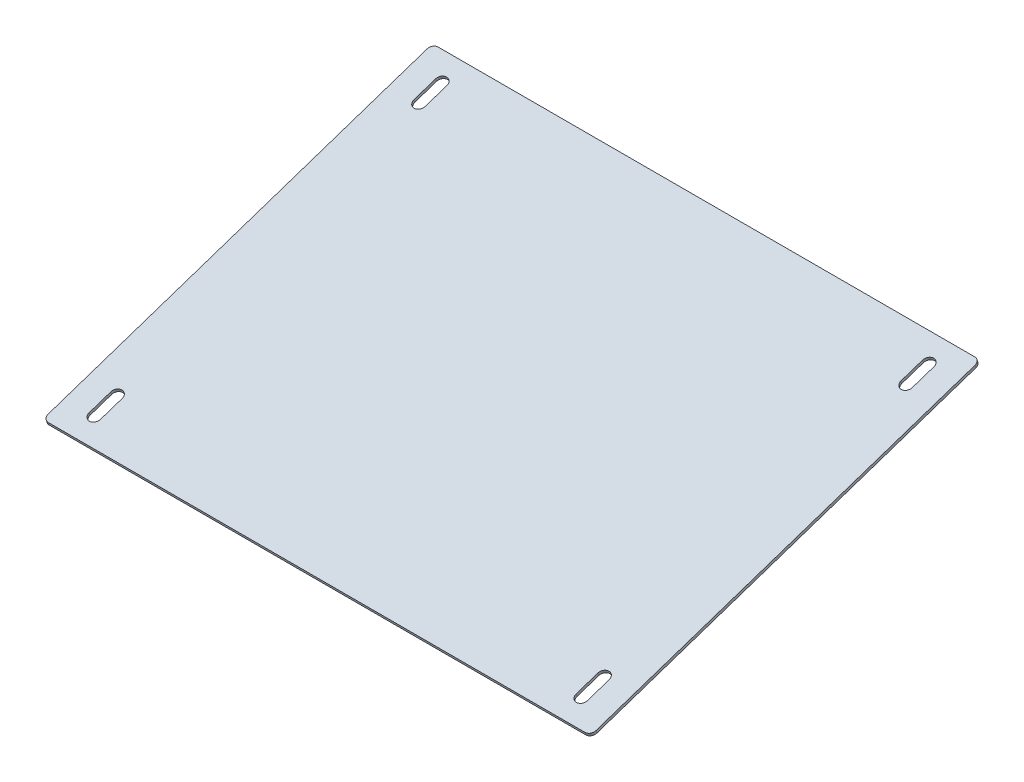
ISO-10303-21;
HEADER;
FILE_DESCRIPTION(('STEP AP214'),'2;1');
FILE_NAME('part.step','',(''),(''),'','','');
FILE_SCHEMA(('AUTOMOTIVE_DESIGN { 1 0 10303 214 1 1 1 1 }'));
ENDSEC;
DATA;
#1=APPLICATION_CONTEXT('core data for automotive mechanical design processes');
#2=APPLICATION_PROTOCOL_DEFINITION('international standard','automotive_design',2000,#1);
#3=PRODUCT_CONTEXT('',#1,'mechanical');
#4=PRODUCT('Part','Part','',(#3));
#5=PRODUCT_RELATED_PRODUCT_CATEGORY('part','',(#4));
#6=PRODUCT_DEFINITION_FORMATION('','',#4);
#7=PRODUCT_DEFINITION_CONTEXT('part definition',#1,'design');
#8=PRODUCT_DEFINITION('design','',#6,#7);
#9=PRODUCT_DEFINITION_SHAPE('','',#8);
#10=(LENGTH_UNIT() NAMED_UNIT(*) SI_UNIT(.MILLI.,.METRE.));
#11=(NAMED_UNIT(*) PLANE_ANGLE_UNIT() SI_UNIT($,.RADIAN.));
#12=(NAMED_UNIT(*) SI_UNIT($,.STERADIAN.) SOLID_ANGLE_UNIT());
#13=UNCERTAINTY_MEASURE_WITH_UNIT(LENGTH_MEASURE(1.E-05),#10,'distance_accuracy_value','');
#14=(GEOMETRIC_REPRESENTATION_CONTEXT(3) GLOBAL_UNCERTAINTY_ASSIGNED_CONTEXT((#13)) GLOBAL_UNIT_ASSIGNED_CONTEXT((#10,
#11,#12)) REPRESENTATION_CONTEXT('',''));
#15=CARTESIAN_POINT('',(0.,0.,0.));
#16=DIRECTION('',(0.,0.,1.));
#17=DIRECTION('',(1.,0.,0.));
#18=AXIS2_PLACEMENT_3D('',#15,#16,#17);
#19=CARTESIAN_POINT('',(277.283333333333,3.01092760528004,1.00744228408499));
#20=DIRECTION('',(-1.,0.,0.));
#21=DIRECTION('',(0.,0.,1.));
#22=AXIS2_PLACEMENT_3D('',#19,#20,#21);
#23=PLANE('',#22);
#24=DIRECTION('',(0.,0.317304656405087,-0.948323655206201));
#25=VECTOR('',#24,1.);
#26=CARTESIAN_POINT('',(277.283333333333,3.50951452999278E-13,-1.1606110765011E-12));
#27=LINE('',#26,#25);
#28=CARTESIAN_POINT('',(277.283333333334,-64.4763061815135,192.6993667379));
#29=VERTEX_POINT('',#28);
#30=CARTESIAN_POINT('',(277.283333333334,-56.4167679088242,168.611945895662));
#31=VERTEX_POINT('',#30);
#32=EDGE_CURVE('E314',#29,#31,#27,.T.);
#33=ORIENTED_EDGE('',*,*,#32,.F.);
#34=DIRECTION('',(0.,-0.948323655206201,-0.317304656405086));
#35=VECTOR('',#34,1.);
#36=CARTESIAN_POINT('',(277.283333333334,-61.4653785762338,193.706809021986));
#37=LINE('',#36,#35);
#38=CARTESIAN_POINT('',(277.283333333334,-61.4653785762338,193.706809021986));
#39=VERTEX_POINT('',#38);
#40=EDGE_CURVE('E322',#39,#29,#37,.T.);
#41=ORIENTED_EDGE('',*,*,#40,.F.);
#42=DIRECTION('',(0.,0.317304656405087,-0.948323655206201));
#43=VECTOR('',#42,1.);
#44=CARTESIAN_POINT('',(277.283333333333,3.01092760528004,1.00744228408499));
#45=LINE('',#44,#43);
#46=CARTESIAN_POINT('',(277.283333333334,-53.4058403035445,169.619388179748));
#47=VERTEX_POINT('',#46);
#48=EDGE_CURVE('E263',#39,#47,#45,.T.);
#49=ORIENTED_EDGE('',*,*,#48,.T.);
#50=DIRECTION('',(0.,-0.948323655206201,-0.317304656405086));
#51=VECTOR('',#50,1.);
#52=CARTESIAN_POINT('',(277.283333333334,-53.4058403035445,169.619388179748));
#53=LINE('',#52,#51);
#54=EDGE_CURVE('E329',#47,#31,#53,.T.);
#55=ORIENTED_EDGE('',*,*,#54,.T.);
#56=EDGE_LOOP('',(#33,#41,#49,#55));
#57=FACE_BOUND('',#56,.T.);
#58=ADVANCED_FACE('F35',(#57),#23,.T.);
#59=CARTESIAN_POINT('',(270.933333333333,-61.4653785762338,193.706809021986));
#60=DIRECTION('',(0.,-0.948323655206201,-0.317304656405086));
#61=DIRECTION('',(0.,0.317304656405086,-0.948323655206201));
#62=AXIS2_PLACEMENT_3D('',#59,#60,#61);
#63=CYLINDRICAL_SURFACE('',#62,6.35000000000002);
#64=CARTESIAN_POINT('',(270.933333333333,-64.4763061815135,192.6993667379));
#65=DIRECTION('',(0.,-0.948323655206201,-0.317304656405087));
#66=DIRECTION('',(0.,0.317304656405087,-0.948323655206201));
#67=AXIS2_PLACEMENT_3D('',#64,#65,#66);
#68=CIRCLE('',#67,6.35000000000002);
#69=CARTESIAN_POINT('',(264.583333333334,-64.4763061815134,192.6993667379));
#70=VERTEX_POINT('',#69);
#71=EDGE_CURVE('E223',#70,#29,#68,.F.);
#72=ORIENTED_EDGE('',*,*,#71,.F.);
#73=DIRECTION('',(0.,-0.948323655206201,-0.317304656405086));
#74=VECTOR('',#73,1.);
#75=CARTESIAN_POINT('',(264.583333333334,-61.4653785762337,193.706809021986));
#76=LINE('',#75,#74);
#77=CARTESIAN_POINT('',(264.583333333334,-61.4653785762337,193.706809021986));
#78=VERTEX_POINT('',#77);
#79=EDGE_CURVE('E325',#78,#70,#76,.T.);
#80=ORIENTED_EDGE('',*,*,#79,.F.);
#81=CARTESIAN_POINT('',(270.933333333333,-61.4653785762338,193.706809021986));
#82=DIRECTION('',(0.,-0.948323655206201,-0.317304656405087));
#83=DIRECTION('',(0.,0.317304656405087,-0.948323655206201));
#84=AXIS2_PLACEMENT_3D('',#81,#82,#83);
#85=CIRCLE('',#84,6.35000000000002);
#86=EDGE_CURVE('E218',#78,#39,#85,.F.);
#87=ORIENTED_EDGE('',*,*,#86,.T.);
#88=ORIENTED_EDGE('',*,*,#40,.T.);
#89=EDGE_LOOP('',(#72,#80,#87,#88));
#90=FACE_BOUND('',#89,.T.);
#91=ADVANCED_FACE('F421',(#90),#63,.F.);
#92=CARTESIAN_POINT('',(264.583333333335,3.01092760527929,1.00744228408724));
#93=DIRECTION('',(-1.,0.,0.));
#94=DIRECTION('',(0.,0.,1.));
#95=AXIS2_PLACEMENT_3D('',#92,#93,#94);
#96=PLANE('',#95);
#97=DIRECTION('',(0.,0.317304656405087,-0.948323655206201));
#98=VECTOR('',#97,1.);
#99=CARTESIAN_POINT('',(264.583333333335,-4.00242662323733E-13,1.08558238658166E-12));
#100=LINE('',#99,#98);
#101=CARTESIAN_POINT('',(264.583333333334,-56.4167679088242,168.611945895662));
#102=VERTEX_POINT('',#101);
#103=EDGE_CURVE('E226',#70,#102,#100,.T.);
#104=ORIENTED_EDGE('',*,*,#103,.T.);
#105=DIRECTION('',(0.,-0.948323655206201,-0.317304656405086));
#106=VECTOR('',#105,1.);
#107=CARTESIAN_POINT('',(264.583333333334,-53.4058403035445,169.619388179748));
#108=LINE('',#107,#106);
#109=CARTESIAN_POINT('',(264.583333333334,-53.4058403035445,169.619388179748));
#110=VERTEX_POINT('',#109);
#111=EDGE_CURVE('E327',#110,#102,#108,.T.);
#112=ORIENTED_EDGE('',*,*,#111,.F.);
#113=DIRECTION('',(0.,0.317304656405087,-0.948323655206201));
#114=VECTOR('',#113,1.);
#115=CARTESIAN_POINT('',(264.583333333335,3.01092760527929,1.00744228408724));
#116=LINE('',#115,#114);
#117=EDGE_CURVE('E269',#78,#110,#116,.T.);
#118=ORIENTED_EDGE('',*,*,#117,.F.);
#119=ORIENTED_EDGE('',*,*,#79,.T.);
#120=EDGE_LOOP('',(#104,#112,#118,#119));
#121=FACE_BOUND('',#120,.T.);
#122=ADVANCED_FACE('F427',(#121),#96,.F.);
#123=CARTESIAN_POINT('',(264.583333333336,3.01092760528076,1.00744228408285));
#124=DIRECTION('',(1.,0.,0.));
#125=DIRECTION('',(0.,0.,-1.));
#126=AXIS2_PLACEMENT_3D('',#123,#124,#125);
#127=PLANE('',#126);
#128=DIRECTION('',(0.,-0.317304656405087,0.948323655206201));
#129=VECTOR('',#128,1.);
#130=CARTESIAN_POINT('',(264.583333333336,1.0675862350167E-12,-3.30129576677926E-12));
#131=LINE('',#130,#129);
#132=CARTESIAN_POINT('',(264.583333333333,64.4763061815136,-192.6993667379));
#133=VERTEX_POINT('',#132);
#134=CARTESIAN_POINT('',(264.583333333334,56.4167679088244,-168.611945895663));
#135=VERTEX_POINT('',#134);
#136=EDGE_CURVE('E302',#133,#135,#131,.T.);
#137=ORIENTED_EDGE('',*,*,#136,.F.);
#138=DIRECTION('',(0.,-0.948323655206201,-0.317304656405086));
#139=VECTOR('',#138,1.);
#140=CARTESIAN_POINT('',(264.583333333333,67.4872337867933,-191.691924453814));
#141=LINE('',#140,#139);
#142=CARTESIAN_POINT('',(264.583333333333,67.4872337867933,-191.691924453814));
#143=VERTEX_POINT('',#142);
#144=EDGE_CURVE('E331',#143,#133,#141,.T.);
#145=ORIENTED_EDGE('',*,*,#144,.F.);
#146=DIRECTION('',(0.,-0.317304656405087,0.948323655206201));
#147=VECTOR('',#146,1.);
#148=CARTESIAN_POINT('',(264.583333333336,3.01092760528076,1.00744228408285));
#149=LINE('',#148,#147);
#150=CARTESIAN_POINT('',(264.583333333334,59.4276955141041,-167.604503611576));
#151=VERTEX_POINT('',#150);
#152=EDGE_CURVE('E252',#143,#151,#149,.T.);
#153=ORIENTED_EDGE('',*,*,#152,.T.);
#154=DIRECTION('',(0.,-0.948323655206201,-0.317304656405086));
#155=VECTOR('',#154,1.);
#156=CARTESIAN_POINT('',(264.583333333334,59.4276955141041,-167.604503611576));
#157=LINE('',#156,#155);
#158=EDGE_CURVE('E337',#151,#135,#157,.T.);
#159=ORIENTED_EDGE('',*,*,#158,.T.);
#160=EDGE_LOOP('',(#137,#145,#153,#159));
#161=FACE_BOUND('',#160,.T.);
#162=ADVANCED_FACE('F439',(#161),#127,.T.);
#163=CARTESIAN_POINT('',(270.933333333333,67.4872337867932,-191.691924453814));
#164=DIRECTION('',(0.,-0.948323655206201,-0.317304656405086));
#165=DIRECTION('',(0.,0.317304656405086,-0.948323655206201));
#166=AXIS2_PLACEMENT_3D('',#163,#164,#165);
#167=CYLINDRICAL_SURFACE('',#166,6.35000000000002);
#168=CARTESIAN_POINT('',(270.933333333333,64.4763061815135,-192.6993667379));
#169=DIRECTION('',(0.,-0.948323655206201,-0.317304656405087));
#170=DIRECTION('',(0.,0.317304656405087,-0.948323655206201));
#171=AXIS2_PLACEMENT_3D('',#168,#169,#170);
#172=CIRCLE('',#171,6.35000000000002);
#173=CARTESIAN_POINT('',(277.283333333333,64.4763061815136,-192.6993667379));
#174=VERTEX_POINT('',#173);
#175=EDGE_CURVE('E311',#174,#133,#172,.F.);
#176=ORIENTED_EDGE('',*,*,#175,.F.);
#177=DIRECTION('',(0.,-0.948323655206201,-0.317304656405086));
#178=VECTOR('',#177,1.);
#179=CARTESIAN_POINT('',(277.283333333333,67.4872337867933,-191.691924453814));
#180=LINE('',#179,#178);
#181=CARTESIAN_POINT('',(277.283333333333,67.4872337867933,-191.691924453814));
#182=VERTEX_POINT('',#181);
#183=EDGE_CURVE('E333',#182,#174,#180,.T.);
#184=ORIENTED_EDGE('',*,*,#183,.F.);
#185=CARTESIAN_POINT('',(270.933333333333,67.4872337867932,-191.691924453814));
#186=DIRECTION('',(0.,-0.948323655206201,-0.317304656405087));
#187=DIRECTION('',(0.,0.317304656405087,-0.948323655206201));
#188=AXIS2_PLACEMENT_3D('',#185,#186,#187);
#189=CIRCLE('',#188,6.35000000000002);
#190=EDGE_CURVE('E260',#182,#143,#189,.F.);
#191=ORIENTED_EDGE('',*,*,#190,.T.);
#192=ORIENTED_EDGE('',*,*,#144,.T.);
#193=EDGE_LOOP('',(#176,#184,#191,#192));
#194=FACE_BOUND('',#193,.T.);
#195=ADVANCED_FACE('F435',(#194),#167,.F.);
#196=CARTESIAN_POINT('',(277.283333333335,3.01092760528042,1.00744228408384));
#197=DIRECTION('',(1.,0.,0.));
#198=DIRECTION('',(0.,0.,-1.));
#199=AXIS2_PLACEMENT_3D('',#196,#197,#198);
#200=PLANE('',#199);
#201=DIRECTION('',(0.,-0.317304656405087,0.948323655206201));
#202=VECTOR('',#201,1.);
#203=CARTESIAN_POINT('',(277.283333333335,7.35522624102473E-13,-2.30997315268166E-12));
#204=LINE('',#203,#202);
#205=CARTESIAN_POINT('',(277.283333333334,56.4167679088244,-168.611945895663));
#206=VERTEX_POINT('',#205);
#207=EDGE_CURVE('E308',#174,#206,#204,.T.);
#208=ORIENTED_EDGE('',*,*,#207,.T.);
#209=DIRECTION('',(0.,-0.948323655206201,-0.317304656405086));
#210=VECTOR('',#209,1.);
#211=CARTESIAN_POINT('',(277.283333333334,59.4276955141041,-167.604503611576));
#212=LINE('',#211,#210);
#213=CARTESIAN_POINT('',(277.283333333334,59.4276955141041,-167.604503611576));
#214=VERTEX_POINT('',#213);
#215=EDGE_CURVE('E335',#214,#206,#212,.T.);
#216=ORIENTED_EDGE('',*,*,#215,.F.);
#217=DIRECTION('',(0.,-0.317304656405087,0.948323655206201));
#218=VECTOR('',#217,1.);
#219=CARTESIAN_POINT('',(277.283333333335,3.01092760528042,1.00744228408384));
#220=LINE('',#219,#218);
#221=EDGE_CURVE('E258',#182,#214,#220,.T.);
#222=ORIENTED_EDGE('',*,*,#221,.F.);
#223=ORIENTED_EDGE('',*,*,#183,.T.);
#224=EDGE_LOOP('',(#208,#216,#222,#223));
#225=FACE_BOUND('',#224,.T.);
#226=ADVANCED_FACE('F438',(#225),#200,.F.);
#227=CARTESIAN_POINT('',(0.,75.5467720594824,-215.779345296051));
#228=DIRECTION('',(0.,-0.317304656405086,0.948323655206201));
#229=DIRECTION('',(0.,-0.948323655206201,-0.317304656405086));
#230=AXIS2_PLACEMENT_3D('',#227,#228,#229);
#231=PLANE('',#230);
#232=DIRECTION('',(-1.,0.,0.));
#233=VECTOR('',#232,1.);
#234=CARTESIAN_POINT('',(0.,72.5358444542027,-216.786787580138));
#235=LINE('',#234,#233);
#236=CARTESIAN_POINT('',(298.45,72.5358444542027,-216.786787580138));
#237=VERTEX_POINT('',#236);
#238=CARTESIAN_POINT('',(-298.45,72.5358444542028,-216.786787580138));
#239=VERTEX_POINT('',#238);
#240=EDGE_CURVE('E291',#237,#239,#235,.T.);
#241=ORIENTED_EDGE('',*,*,#240,.T.);
#242=DIRECTION('',(0.,-0.948323655206201,-0.317304656405086));
#243=VECTOR('',#242,1.);
#244=CARTESIAN_POINT('',(-298.45,75.5467720594824,-215.779345296052));
#245=LINE('',#244,#243);
#246=CARTESIAN_POINT('',(-298.45,75.5467720594825,-215.779345296052));
#247=VERTEX_POINT('',#246);
#248=EDGE_CURVE('E380',#239,#247,#245,.F.);
#249=ORIENTED_EDGE('',*,*,#248,.T.);
#250=DIRECTION('',(-1.,0.,0.));
#251=VECTOR('',#250,1.);
#252=CARTESIAN_POINT('',(0.,75.5467720594824,-215.779345296051));
#253=LINE('',#252,#251);
#254=CARTESIAN_POINT('',(298.45,75.5467720594824,-215.779345296051));
#255=VERTEX_POINT('',#254);
#256=EDGE_CURVE('E241',#255,#247,#253,.T.);
#257=ORIENTED_EDGE('',*,*,#256,.F.);
#258=DIRECTION('',(0.,-0.948323655206201,-0.317304656405086));
#259=VECTOR('',#258,1.);
#260=CARTESIAN_POINT('',(298.45,75.5467720594824,-215.779345296051));
#261=LINE('',#260,#259);
#262=EDGE_CURVE('E377',#255,#237,#261,.T.);
#263=ORIENTED_EDGE('',*,*,#262,.T.);
#264=EDGE_LOOP('',(#241,#249,#257,#263));
#265=FACE_BOUND('',#264,.T.);
#266=ADVANCED_FACE('F397',(#265),#231,.F.);
#267=CARTESIAN_POINT('',(-304.8,3.01092760527967,1.00744228408614));
#268=DIRECTION('',(-1.,0.,0.));
#269=DIRECTION('',(0.,0.,1.));
#270=AXIS2_PLACEMENT_3D('',#267,#268,#269);
#271=PLANE('',#270);
#272=DIRECTION('',(0.,0.317304656405086,-0.948323655206201));
#273=VECTOR('',#272,1.);
#274=CARTESIAN_POINT('',(-304.8,0.,0.));
#275=LINE('',#274,#273);
#276=CARTESIAN_POINT('',(-304.8,-70.5209598860305,210.764932369578));
#277=VERTEX_POINT('',#276);
#278=CARTESIAN_POINT('',(-304.8,70.5209598860305,-210.764932369578));
#279=VERTEX_POINT('',#278);
#280=EDGE_CURVE('E299',#277,#279,#275,.T.);
#281=ORIENTED_EDGE('',*,*,#280,.F.);
#282=DIRECTION('',(0.,-0.948323655206201,-0.317304656405086));
#283=VECTOR('',#282,1.);
#284=CARTESIAN_POINT('',(-304.8,-67.5100322807507,211.772374653664));
#285=LINE('',#284,#283);
#286=CARTESIAN_POINT('',(-304.8,-67.5100322807508,211.772374653664));
#287=VERTEX_POINT('',#286);
#288=EDGE_CURVE('E368',#277,#287,#285,.F.);
#289=ORIENTED_EDGE('',*,*,#288,.T.);
#290=DIRECTION('',(0.,0.317304656405086,-0.948323655206201));
#291=VECTOR('',#290,1.);
#292=CARTESIAN_POINT('',(-304.8,3.01092760527967,1.00744228408614));
#293=LINE('',#292,#291);
#294=CARTESIAN_POINT('',(-304.8,73.5318874913102,-209.757490085492));
#295=VERTEX_POINT('',#294);
#296=EDGE_CURVE('E249',#287,#295,#293,.T.);
#297=ORIENTED_EDGE('',*,*,#296,.T.);
#298=DIRECTION('',(0.,-0.948323655206201,-0.317304656405086));
#299=VECTOR('',#298,1.);
#300=CARTESIAN_POINT('',(-304.8,70.5209598860305,-210.764932369578));
#301=LINE('',#300,#299);
#302=EDGE_CURVE('E365',#295,#279,#301,.T.);
#303=ORIENTED_EDGE('',*,*,#302,.T.);
#304=EDGE_LOOP('',(#281,#289,#297,#303));
#305=FACE_BOUND('',#304,.T.);
#306=ADVANCED_FACE('F407',(#305),#271,.T.);
#307=CARTESIAN_POINT('',(0.,-69.5249168489231,217.794229864224));
#308=DIRECTION('',(0.,-0.317304656405086,0.948323655206201));
#309=DIRECTION('',(0.,-0.948323655206201,-0.317304656405086));
#310=AXIS2_PLACEMENT_3D('',#307,#308,#309);
#311=PLANE('',#310);
#312=DIRECTION('',(-1.,0.,0.));
#313=VECTOR('',#312,1.);
#314=CARTESIAN_POINT('',(0.,-69.5249168489231,217.794229864224));
#315=LINE('',#314,#313);
#316=CARTESIAN_POINT('',(298.45,-69.5249168489231,217.794229864224));
#317=VERTEX_POINT('',#316);
#318=CARTESIAN_POINT('',(-298.45,-69.5249168489231,217.794229864224));
#319=VERTEX_POINT('',#318);
#320=EDGE_CURVE('E246',#317,#319,#315,.T.);
#321=ORIENTED_EDGE('',*,*,#320,.T.);
#322=DIRECTION('',(0.,-0.948323655206201,-0.317304656405086));
#323=VECTOR('',#322,1.);
#324=CARTESIAN_POINT('',(-298.45,-69.5249168489231,217.794229864224));
#325=LINE('',#324,#323);
#326=CARTESIAN_POINT('',(-298.45,-72.5358444542028,216.786787580138));
#327=VERTEX_POINT('',#326);
#328=EDGE_CURVE('E354',#319,#327,#325,.T.);
#329=ORIENTED_EDGE('',*,*,#328,.T.);
#330=DIRECTION('',(-1.,0.,0.));
#331=VECTOR('',#330,1.);
#332=CARTESIAN_POINT('',(0.,-72.5358444542028,216.786787580138));
#333=LINE('',#332,#331);
#334=CARTESIAN_POINT('',(298.45,-72.5358444542028,216.786787580138));
#335=VERTEX_POINT('',#334);
#336=EDGE_CURVE('E296',#335,#327,#333,.T.);
#337=ORIENTED_EDGE('',*,*,#336,.F.);
#338=DIRECTION('',(0.,-0.948323655206201,-0.317304656405086));
#339=VECTOR('',#338,1.);
#340=CARTESIAN_POINT('',(298.45,-69.5249168489231,217.794229864224));
#341=LINE('',#340,#339);
#342=EDGE_CURVE('E324',#335,#317,#341,.F.);
#343=ORIENTED_EDGE('',*,*,#342,.T.);
#344=EDGE_LOOP('',(#321,#329,#337,#343));
#345=FACE_BOUND('',#344,.T.);
#346=ADVANCED_FACE('F414',(#345),#311,.T.);
#347=CARTESIAN_POINT('',(-270.933333333333,59.4276955141041,-167.604503611576));
#348=DIRECTION('',(0.,-0.948323655206201,-0.317304656405086));
#349=DIRECTION('',(0.,0.317304656405086,-0.948323655206201));
#350=AXIS2_PLACEMENT_3D('',#347,#348,#349);
#351=CYLINDRICAL_SURFACE('',#350,6.34999999999997);
#352=CARTESIAN_POINT('',(-270.933333333333,56.4167679088244,-168.611945895663));
#353=DIRECTION('',(0.,-0.948323655206201,-0.317304656405087));
#354=DIRECTION('',(0.,0.317304656405087,-0.948323655206201));
#355=AXIS2_PLACEMENT_3D('',#352,#353,#354);
#356=CIRCLE('',#355,6.34999999999997);
#357=CARTESIAN_POINT('',(-264.583333333333,56.4167679088244,-168.611945895663));
#358=VERTEX_POINT('',#357);
#359=CARTESIAN_POINT('',(-277.283333333333,56.4167679088244,-168.611945895663));
#360=VERTEX_POINT('',#359);
#361=EDGE_CURVE('E281',#358,#360,#356,.T.);
#362=ORIENTED_EDGE('',*,*,#361,.T.);
#363=DIRECTION('',(0.,-0.948323655206201,-0.317304656405086));
#364=VECTOR('',#363,1.);
#365=CARTESIAN_POINT('',(-277.283333333333,59.4276955141041,-167.604503611576));
#366=LINE('',#365,#364);
#367=CARTESIAN_POINT('',(-277.283333333333,59.4276955141041,-167.604503611576));
#368=VERTEX_POINT('',#367);
#369=EDGE_CURVE('E339',#368,#360,#366,.T.);
#370=ORIENTED_EDGE('',*,*,#369,.F.);
#371=CARTESIAN_POINT('',(-270.933333333333,59.4276955141041,-167.604503611576));
#372=DIRECTION('',(0.,-0.948323655206201,-0.317304656405087));
#373=DIRECTION('',(0.,0.317304656405087,-0.948323655206201));
#374=AXIS2_PLACEMENT_3D('',#371,#372,#373);
#375=CIRCLE('',#374,6.34999999999997);
#376=CARTESIAN_POINT('',(-264.583333333333,59.4276955141041,-167.604503611576));
#377=VERTEX_POINT('',#376);
#378=EDGE_CURVE('E232',#377,#368,#375,.T.);
#379=ORIENTED_EDGE('',*,*,#378,.F.);
#380=DIRECTION('',(0.,-0.948323655206201,-0.317304656405086));
#381=VECTOR('',#380,1.);
#382=CARTESIAN_POINT('',(-264.583333333333,59.4276955141041,-167.604503611576));
#383=LINE('',#382,#381);
#384=EDGE_CURVE('E346',#377,#358,#383,.T.);
#385=ORIENTED_EDGE('',*,*,#384,.T.);
#386=EDGE_LOOP('',(#362,#370,#379,#385));
#387=FACE_BOUND('',#386,.T.);
#388=ADVANCED_FACE('F456',(#387),#351,.F.);
#389=CARTESIAN_POINT('',(-277.283333333335,3.01092760528044,1.00744228408384));
#390=DIRECTION('',(1.,0.,0.));
#391=DIRECTION('',(0.,0.,-1.));
#392=AXIS2_PLACEMENT_3D('',#389,#390,#391);
#393=PLANE('',#392);
#394=DIRECTION('',(0.,-0.317304656405087,0.948323655206201));
#395=VECTOR('',#394,1.);
#396=CARTESIAN_POINT('',(-277.283333333335,7.50119522469965E-13,-2.30508909880865E-12));
#397=LINE('',#396,#395);
#398=CARTESIAN_POINT('',(-277.283333333333,64.4763061815136,-192.6993667379));
#399=VERTEX_POINT('',#398);
#400=EDGE_CURVE('E288',#399,#360,#397,.T.);
#401=ORIENTED_EDGE('',*,*,#400,.F.);
#402=DIRECTION('',(0.,-0.948323655206201,-0.317304656405086));
#403=VECTOR('',#402,1.);
#404=CARTESIAN_POINT('',(-277.283333333333,67.4872337867933,-191.691924453814));
#405=LINE('',#404,#403);
#406=CARTESIAN_POINT('',(-277.283333333333,67.4872337867933,-191.691924453814));
#407=VERTEX_POINT('',#406);
#408=EDGE_CURVE('E341',#407,#399,#405,.T.);
#409=ORIENTED_EDGE('',*,*,#408,.F.);
#410=DIRECTION('',(0.,-0.317304656405087,0.948323655206201));
#411=VECTOR('',#410,1.);
#412=CARTESIAN_POINT('',(-277.283333333335,3.01092760528044,1.00744228408384));
#413=LINE('',#412,#411);
#414=EDGE_CURVE('E238',#407,#368,#413,.T.);
#415=ORIENTED_EDGE('',*,*,#414,.T.);
#416=ORIENTED_EDGE('',*,*,#369,.T.);
#417=EDGE_LOOP('',(#401,#409,#415,#416));
#418=FACE_BOUND('',#417,.T.);
#419=ADVANCED_FACE('F462',(#418),#393,.T.);
#420=CARTESIAN_POINT('',(-270.933333333333,67.4872337867933,-191.691924453814));
#421=DIRECTION('',(0.,-0.948323655206201,-0.317304656405086));
#422=DIRECTION('',(0.,0.317304656405086,-0.948323655206201));
#423=AXIS2_PLACEMENT_3D('',#420,#421,#422);
#424=CYLINDRICAL_SURFACE('',#423,6.35000000000002);
#425=CARTESIAN_POINT('',(-270.933333333333,64.4763061815136,-192.6993667379));
#426=DIRECTION('',(0.,-0.948323655206201,-0.317304656405087));
#427=DIRECTION('',(0.,0.317304656405087,-0.948323655206201));
#428=AXIS2_PLACEMENT_3D('',#425,#426,#427);
#429=CIRCLE('',#428,6.35000000000002);
#430=CARTESIAN_POINT('',(-264.583333333333,64.4763061815136,-192.6993667379));
#431=VERTEX_POINT('',#430);
#432=EDGE_CURVE('E286',#399,#431,#429,.T.);
#433=ORIENTED_EDGE('',*,*,#432,.T.);
#434=DIRECTION('',(0.,-0.948323655206201,-0.317304656405086));
#435=VECTOR('',#434,1.);
#436=CARTESIAN_POINT('',(-264.583333333333,67.4872337867933,-191.691924453814));
#437=LINE('',#436,#435);
#438=CARTESIAN_POINT('',(-264.583333333333,67.4872337867933,-191.691924453814));
#439=VERTEX_POINT('',#438);
#440=EDGE_CURVE('E343',#439,#431,#437,.T.);
#441=ORIENTED_EDGE('',*,*,#440,.F.);
#442=CARTESIAN_POINT('',(-270.933333333333,67.4872337867933,-191.691924453814));
#443=DIRECTION('',(0.,-0.948323655206201,-0.317304656405087));
#444=DIRECTION('',(0.,0.317304656405087,-0.948323655206201));
#445=AXIS2_PLACEMENT_3D('',#442,#443,#444);
#446=CIRCLE('',#445,6.35000000000002);
#447=EDGE_CURVE('E236',#407,#439,#446,.T.);
#448=ORIENTED_EDGE('',*,*,#447,.F.);
#449=ORIENTED_EDGE('',*,*,#408,.T.);
#450=EDGE_LOOP('',(#433,#441,#448,#449));
#451=FACE_BOUND('',#450,.T.);
#452=ADVANCED_FACE('F465',(#451),#424,.F.);
#453=CARTESIAN_POINT('',(-270.933333333333,-53.4058403035446,169.619388179749));
#454=DIRECTION('',(0.,-0.948323655206201,-0.317304656405086));
#455=DIRECTION('',(0.,0.317304656405086,-0.948323655206201));
#456=AXIS2_PLACEMENT_3D('',#453,#454,#455);
#457=CYLINDRICAL_SURFACE('',#456,6.34999999999991);
#458=CARTESIAN_POINT('',(-270.933333333333,-56.4167679088243,168.611945895662));
#459=DIRECTION('',(0.,-0.948323655206201,-0.317304656405087));
#460=DIRECTION('',(0.,0.317304656405087,-0.948323655206201));
#461=AXIS2_PLACEMENT_3D('',#458,#459,#460);
#462=CIRCLE('',#461,6.34999999999991);
#463=CARTESIAN_POINT('',(-277.283333333333,-56.4167679088243,168.611945895662));
#464=VERTEX_POINT('',#463);
#465=CARTESIAN_POINT('',(-264.583333333333,-56.4167679088243,168.611945895662));
#466=VERTEX_POINT('',#465);
#467=EDGE_CURVE('E273',#464,#466,#462,.T.);
#468=ORIENTED_EDGE('',*,*,#467,.T.);
#469=DIRECTION('',(0.,-0.948323655206201,-0.317304656405086));
#470=VECTOR('',#469,1.);
#471=CARTESIAN_POINT('',(-264.583333333333,-53.4058403035446,169.619388179749));
#472=LINE('',#471,#470);
#473=CARTESIAN_POINT('',(-264.583333333333,-53.4058403035446,169.619388179749));
#474=VERTEX_POINT('',#473);
#475=EDGE_CURVE('E221',#474,#466,#472,.T.);
#476=ORIENTED_EDGE('',*,*,#475,.F.);
#477=CARTESIAN_POINT('',(-270.933333333333,-53.4058403035446,169.619388179749));
#478=DIRECTION('',(0.,-0.948323655206201,-0.317304656405087));
#479=DIRECTION('',(0.,0.317304656405087,-0.948323655206201));
#480=AXIS2_PLACEMENT_3D('',#477,#478,#479);
#481=CIRCLE('',#480,6.34999999999991);
#482=CARTESIAN_POINT('',(-277.283333333333,-53.4058403035446,169.619388179749));
#483=VERTEX_POINT('',#482);
#484=EDGE_CURVE('E201',#483,#474,#481,.T.);
#485=ORIENTED_EDGE('',*,*,#484,.F.);
#486=DIRECTION('',(0.,-0.948323655206201,-0.317304656405086));
#487=VECTOR('',#486,1.);
#488=CARTESIAN_POINT('',(-277.283333333333,-53.4058403035446,169.619388179749));
#489=LINE('',#488,#487);
#490=EDGE_CURVE('E210',#483,#464,#489,.T.);
#491=ORIENTED_EDGE('',*,*,#490,.T.);
#492=EDGE_LOOP('',(#468,#476,#485,#491));
#493=FACE_BOUND('',#492,.T.);
#494=ADVANCED_FACE('F220',(#493),#457,.F.);
#495=CARTESIAN_POINT('',(-264.583333333334,3.0109276052793,1.00744228408724));
#496=DIRECTION('',(-1.,0.,0.));
#497=DIRECTION('',(0.,0.,1.));
#498=AXIS2_PLACEMENT_3D('',#495,#496,#497);
#499=PLANE('',#498);
#500=DIRECTION('',(0.,0.317304656405087,-0.948323655206201));
#501=VECTOR('',#500,1.);
#502=CARTESIAN_POINT('',(-264.583333333334,-3.86314324186811E-13,1.09024274333071E-12));
#503=LINE('',#502,#501);
#504=CARTESIAN_POINT('',(-264.583333333333,-64.4763061815135,192.6993667379));
#505=VERTEX_POINT('',#504);
#506=EDGE_CURVE('E278',#505,#466,#503,.T.);
#507=ORIENTED_EDGE('',*,*,#506,.F.);
#508=DIRECTION('',(0.,-0.948323655206201,-0.317304656405086));
#509=VECTOR('',#508,1.);
#510=CARTESIAN_POINT('',(-264.583333333333,-61.4653785762338,193.706809021986));
#511=LINE('',#510,#509);
#512=CARTESIAN_POINT('',(-264.583333333333,-61.4653785762338,193.706809021986));
#513=VERTEX_POINT('',#512);
#514=EDGE_CURVE('E350',#513,#505,#511,.T.);
#515=ORIENTED_EDGE('',*,*,#514,.F.);
#516=DIRECTION('',(0.,0.317304656405087,-0.948323655206201));
#517=VECTOR('',#516,1.);
#518=CARTESIAN_POINT('',(-264.583333333334,3.0109276052793,1.00744228408724));
#519=LINE('',#518,#517);
#520=EDGE_CURVE('E230',#513,#474,#519,.T.);
#521=ORIENTED_EDGE('',*,*,#520,.T.);
#522=ORIENTED_EDGE('',*,*,#475,.T.);
#523=EDGE_LOOP('',(#507,#515,#521,#522));
#524=FACE_BOUND('',#523,.T.);
#525=ADVANCED_FACE('F476',(#524),#499,.T.);
#526=CARTESIAN_POINT('',(-270.933333333333,-61.4653785762338,193.706809021986));
#527=DIRECTION('',(0.,-0.948323655206201,-0.317304656405086));
#528=DIRECTION('',(0.,0.317304656405086,-0.948323655206201));
#529=AXIS2_PLACEMENT_3D('',#526,#527,#528);
#530=CYLINDRICAL_SURFACE('',#529,6.35000000000002);
#531=CARTESIAN_POINT('',(-270.933333333333,-64.4763061815135,192.6993667379));
#532=DIRECTION('',(0.,-0.948323655206201,-0.317304656405087));
#533=DIRECTION('',(0.,0.317304656405087,-0.948323655206201));
#534=AXIS2_PLACEMENT_3D('',#531,#532,#533);
#535=CIRCLE('',#534,6.35000000000002);
#536=CARTESIAN_POINT('',(-277.283333333333,-64.4763061815135,192.6993667379));
#537=VERTEX_POINT('',#536);
#538=EDGE_CURVE('E276',#505,#537,#535,.T.);
#539=ORIENTED_EDGE('',*,*,#538,.T.);
#540=DIRECTION('',(0.,-0.948323655206201,-0.317304656405086));
#541=VECTOR('',#540,1.);
#542=CARTESIAN_POINT('',(-277.283333333333,-61.4653785762338,193.706809021986));
#543=LINE('',#542,#541);
#544=CARTESIAN_POINT('',(-277.283333333333,-61.4653785762338,193.706809021986));
#545=VERTEX_POINT('',#544);
#546=EDGE_CURVE('E217',#545,#537,#543,.T.);
#547=ORIENTED_EDGE('',*,*,#546,.F.);
#548=CARTESIAN_POINT('',(-270.933333333333,-61.4653785762338,193.706809021986));
#549=DIRECTION('',(0.,-0.948323655206201,-0.317304656405087));
#550=DIRECTION('',(0.,0.317304656405087,-0.948323655206201));
#551=AXIS2_PLACEMENT_3D('',#548,#549,#550);
#552=CIRCLE('',#551,6.35000000000002);
#553=EDGE_CURVE('E204',#513,#545,#552,.T.);
#554=ORIENTED_EDGE('',*,*,#553,.F.);
#555=ORIENTED_EDGE('',*,*,#514,.T.);
#556=EDGE_LOOP('',(#539,#547,#554,#555));
#557=FACE_BOUND('',#556,.T.);
#558=ADVANCED_FACE('F447',(#557),#530,.F.);
#559=CARTESIAN_POINT('',(270.933333333334,59.4276955141041,-167.604503611577));
#560=DIRECTION('',(0.,-0.948323655206201,-0.317304656405086));
#561=DIRECTION('',(0.,0.317304656405086,-0.948323655206201));
#562=AXIS2_PLACEMENT_3D('',#559,#560,#561);
#563=CYLINDRICAL_SURFACE('',#562,6.34999999999997);
#564=CARTESIAN_POINT('',(270.933333333334,56.4167679088244,-168.611945895663));
#565=DIRECTION('',(0.,-0.948323655206201,-0.317304656405087));
#566=DIRECTION('',(0.,0.317304656405087,-0.948323655206201));
#567=AXIS2_PLACEMENT_3D('',#564,#565,#566);
#568=CIRCLE('',#567,6.34999999999997);
#569=EDGE_CURVE('E305',#135,#206,#568,.F.);
#570=ORIENTED_EDGE('',*,*,#569,.F.);
#571=ORIENTED_EDGE('',*,*,#158,.F.);
#572=CARTESIAN_POINT('',(270.933333333334,59.4276955141041,-167.604503611577));
#573=DIRECTION('',(0.,-0.948323655206201,-0.317304656405087));
#574=DIRECTION('',(0.,0.317304656405087,-0.948323655206201));
#575=AXIS2_PLACEMENT_3D('',#572,#573,#574);
#576=CIRCLE('',#575,6.34999999999997);
#577=EDGE_CURVE('E255',#151,#214,#576,.F.);
#578=ORIENTED_EDGE('',*,*,#577,.T.);
#579=ORIENTED_EDGE('',*,*,#215,.T.);
#580=EDGE_LOOP('',(#570,#571,#578,#579));
#581=FACE_BOUND('',#580,.T.);
#582=ADVANCED_FACE('F444',(#581),#563,.F.);
#583=CARTESIAN_POINT('',(304.8,3.01092760527965,1.00744228408614));
#584=DIRECTION('',(-1.,0.,0.));
#585=DIRECTION('',(0.,0.,1.));
#586=AXIS2_PLACEMENT_3D('',#583,#584,#585);
#587=PLANE('',#586);
#588=DIRECTION('',(0.,0.317304656405087,-0.948323655206201));
#589=VECTOR('',#588,1.);
#590=CARTESIAN_POINT('',(304.8,0.,0.));
#591=LINE('',#590,#589);
#592=CARTESIAN_POINT('',(304.8,-70.5209598860305,210.764932369578));
#593=VERTEX_POINT('',#592);
#594=CARTESIAN_POINT('',(304.8,70.5209598860305,-210.764932369578));
#595=VERTEX_POINT('',#594);
#596=EDGE_CURVE('E294',#593,#595,#591,.T.);
#597=ORIENTED_EDGE('',*,*,#596,.T.);
#598=DIRECTION('',(0.,-0.948323655206201,-0.317304656405086));
#599=VECTOR('',#598,1.);
#600=CARTESIAN_POINT('',(304.8,73.5318874913101,-209.757490085492));
#601=LINE('',#600,#599);
#602=CARTESIAN_POINT('',(304.8,73.5318874913101,-209.757490085492));
#603=VERTEX_POINT('',#602);
#604=EDGE_CURVE('E11',#595,#603,#601,.F.);
#605=ORIENTED_EDGE('',*,*,#604,.T.);
#606=DIRECTION('',(0.,0.317304656405087,-0.948323655206201));
#607=VECTOR('',#606,1.);
#608=CARTESIAN_POINT('',(304.8,3.01092760527965,1.00744228408614));
#609=LINE('',#608,#607);
#610=CARTESIAN_POINT('',(304.8,-67.5100322807508,211.772374653664));
#611=VERTEX_POINT('',#610);
#612=EDGE_CURVE('E244',#611,#603,#609,.T.);
#613=ORIENTED_EDGE('',*,*,#612,.F.);
#614=DIRECTION('',(0.,-0.948323655206201,-0.317304656405086));
#615=VECTOR('',#614,1.);
#616=CARTESIAN_POINT('',(304.8,-70.5209598860304,210.764932369578));
#617=LINE('',#616,#615);
#618=EDGE_CURVE('E43',#611,#593,#617,.T.);
#619=ORIENTED_EDGE('',*,*,#618,.T.);
#620=EDGE_LOOP('',(#597,#605,#613,#619));
#621=FACE_BOUND('',#620,.T.);
#622=ADVANCED_FACE('F384',(#621),#587,.F.);
#623=CARTESIAN_POINT('',(-264.583333333336,3.01092760528077,1.00744228408285));
#624=DIRECTION('',(1.,0.,0.));
#625=DIRECTION('',(0.,0.,-1.));
#626=AXIS2_PLACEMENT_3D('',#623,#624,#625);
#627=PLANE('',#626);
#628=DIRECTION('',(0.,-0.317304656405087,0.948323655206201));
#629=VECTOR('',#628,1.);
#630=CARTESIAN_POINT('',(-264.583333333336,1.08151457315362E-12,-3.2966354100302E-12));
#631=LINE('',#630,#629);
#632=EDGE_CURVE('E284',#431,#358,#631,.T.);
#633=ORIENTED_EDGE('',*,*,#632,.T.);
#634=ORIENTED_EDGE('',*,*,#384,.F.);
#635=DIRECTION('',(0.,-0.317304656405087,0.948323655206201));
#636=VECTOR('',#635,1.);
#637=CARTESIAN_POINT('',(-264.583333333336,3.01092760528077,1.00744228408285));
#638=LINE('',#637,#636);
#639=EDGE_CURVE('E234',#439,#377,#638,.T.);
#640=ORIENTED_EDGE('',*,*,#639,.F.);
#641=ORIENTED_EDGE('',*,*,#440,.T.);
#642=EDGE_LOOP('',(#633,#634,#640,#641));
#643=FACE_BOUND('',#642,.T.);
#644=ADVANCED_FACE('F459',(#643),#627,.F.);
#645=CARTESIAN_POINT('',(-277.283333333332,3.01092760528005,1.00744228408499));
#646=DIRECTION('',(-1.,0.,0.));
#647=DIRECTION('',(0.,0.,1.));
#648=AXIS2_PLACEMENT_3D('',#645,#646,#647);
#649=PLANE('',#648);
#650=DIRECTION('',(0.,0.317304656405087,-0.948323655206201));
#651=VECTOR('',#650,1.);
#652=CARTESIAN_POINT('',(-277.283333333332,3.6554835136677E-13,-1.15572702262809E-12));
#653=LINE('',#652,#651);
#654=EDGE_CURVE('E213',#537,#464,#653,.T.);
#655=ORIENTED_EDGE('',*,*,#654,.T.);
#656=ORIENTED_EDGE('',*,*,#490,.F.);
#657=DIRECTION('',(0.,0.317304656405087,-0.948323655206201));
#658=VECTOR('',#657,1.);
#659=CARTESIAN_POINT('',(-277.283333333332,3.01092760528005,1.00744228408499));
#660=LINE('',#659,#658);
#661=EDGE_CURVE('E195',#545,#483,#660,.T.);
#662=ORIENTED_EDGE('',*,*,#661,.F.);
#663=ORIENTED_EDGE('',*,*,#546,.T.);
#664=EDGE_LOOP('',(#655,#656,#662,#663));
#665=FACE_BOUND('',#664,.T.);
#666=ADVANCED_FACE('F211',(#665),#649,.F.);
#667=CARTESIAN_POINT('',(270.933333333334,-53.4058403035445,169.619388179748));
#668=DIRECTION('',(0.,-0.948323655206201,-0.317304656405086));
#669=DIRECTION('',(0.,0.317304656405086,-0.948323655206201));
#670=AXIS2_PLACEMENT_3D('',#667,#668,#669);
#671=CYLINDRICAL_SURFACE('',#670,6.34999999999991);
#672=CARTESIAN_POINT('',(270.933333333334,-56.4167679088242,168.611945895662));
#673=DIRECTION('',(0.,-0.948323655206201,-0.317304656405087));
#674=DIRECTION('',(0.,0.317304656405087,-0.948323655206201));
#675=AXIS2_PLACEMENT_3D('',#672,#673,#674);
#676=CIRCLE('',#675,6.34999999999991);
#677=EDGE_CURVE('E317',#31,#102,#676,.F.);
#678=ORIENTED_EDGE('',*,*,#677,.F.);
#679=ORIENTED_EDGE('',*,*,#54,.F.);
#680=CARTESIAN_POINT('',(270.933333333334,-53.4058403035445,169.619388179748));
#681=DIRECTION('',(0.,-0.948323655206201,-0.317304656405087));
#682=DIRECTION('',(0.,0.317304656405087,-0.948323655206201));
#683=AXIS2_PLACEMENT_3D('',#680,#681,#682);
#684=CIRCLE('',#683,6.34999999999991);
#685=EDGE_CURVE('E266',#47,#110,#684,.F.);
#686=ORIENTED_EDGE('',*,*,#685,.T.);
#687=ORIENTED_EDGE('',*,*,#111,.T.);
#688=EDGE_LOOP('',(#678,#679,#686,#687));
#689=FACE_BOUND('',#688,.T.);
#690=ADVANCED_FACE('F433',(#689),#671,.F.);
#691=CARTESIAN_POINT('',(0.,3.01092760527966,1.00744228408614));
#692=DIRECTION('',(0.,-0.948323655206201,-0.317304656405087));
#693=DIRECTION('',(0.,0.317304656405087,-0.948323655206201));
#694=AXIS2_PLACEMENT_3D('',#691,#692,#693);
#695=PLANE('',#694);
#696=ORIENTED_EDGE('',*,*,#484,.T.);
#697=ORIENTED_EDGE('',*,*,#520,.F.);
#698=ORIENTED_EDGE('',*,*,#553,.T.);
#699=ORIENTED_EDGE('',*,*,#661,.T.);
#700=EDGE_LOOP('',(#696,#697,#698,#699));
#701=FACE_BOUND('',#700,.T.);
#702=ORIENTED_EDGE('',*,*,#378,.T.);
#703=ORIENTED_EDGE('',*,*,#414,.F.);
#704=ORIENTED_EDGE('',*,*,#447,.T.);
#705=ORIENTED_EDGE('',*,*,#639,.T.);
#706=EDGE_LOOP('',(#702,#703,#704,#705));
#707=FACE_BOUND('',#706,.T.);
#708=ORIENTED_EDGE('',*,*,#296,.F.);
#709=CARTESIAN_POINT('',(-298.45,-67.5100322807508,211.772374653664));
#710=DIRECTION('',(0.,-0.948323655206201,-0.317304656405087));
#711=DIRECTION('',(0.,0.317304656405087,-0.948323655206201));
#712=AXIS2_PLACEMENT_3D('',#709,#710,#711);
#713=CIRCLE('',#712,6.35);
#714=EDGE_CURVE('E375',#287,#319,#713,.F.);
#715=ORIENTED_EDGE('',*,*,#714,.T.);
#716=ORIENTED_EDGE('',*,*,#320,.F.);
#717=CARTESIAN_POINT('',(298.45,-67.5100322807508,211.772374653664));
#718=DIRECTION('',(0.,-0.948323655206201,-0.317304656405087));
#719=DIRECTION('',(0.,0.317304656405087,-0.948323655206201));
#720=AXIS2_PLACEMENT_3D('',#717,#718,#719);
#721=CIRCLE('',#720,6.35);
#722=EDGE_CURVE('E55',#317,#611,#721,.F.);
#723=ORIENTED_EDGE('',*,*,#722,.T.);
#724=ORIENTED_EDGE('',*,*,#612,.T.);
#725=CARTESIAN_POINT('',(298.45,73.5318874913101,-209.757490085492));
#726=DIRECTION('',(0.,-0.948323655206201,-0.317304656405087));
#727=DIRECTION('',(0.,0.317304656405087,-0.948323655206201));
#728=AXIS2_PLACEMENT_3D('',#725,#726,#727);
#729=CIRCLE('',#728,6.35);
#730=EDGE_CURVE('E371',#603,#255,#729,.F.);
#731=ORIENTED_EDGE('',*,*,#730,.T.);
#732=ORIENTED_EDGE('',*,*,#256,.T.);
#733=CARTESIAN_POINT('',(-298.45,73.5318874913102,-209.757490085492));
#734=DIRECTION('',(0.,-0.948323655206201,-0.317304656405087));
#735=DIRECTION('',(0.,0.317304656405087,-0.948323655206201));
#736=AXIS2_PLACEMENT_3D('',#733,#734,#735);
#737=CIRCLE('',#736,6.35);
#738=EDGE_CURVE('E373',#247,#295,#737,.F.);
#739=ORIENTED_EDGE('',*,*,#738,.T.);
#740=EDGE_LOOP('',(#708,#715,#716,#723,#724,#731,#732,#739));
#741=FACE_BOUND('',#740,.T.);
#742=ORIENTED_EDGE('',*,*,#152,.F.);
#743=ORIENTED_EDGE('',*,*,#190,.F.);
#744=ORIENTED_EDGE('',*,*,#221,.T.);
#745=ORIENTED_EDGE('',*,*,#577,.F.);
#746=EDGE_LOOP('',(#742,#743,#744,#745));
#747=FACE_BOUND('',#746,.T.);
#748=ORIENTED_EDGE('',*,*,#48,.F.);
#749=ORIENTED_EDGE('',*,*,#86,.F.);
#750=ORIENTED_EDGE('',*,*,#117,.T.);
#751=ORIENTED_EDGE('',*,*,#685,.F.);
#752=EDGE_LOOP('',(#748,#749,#750,#751));
#753=FACE_BOUND('',#752,.T.);
#754=ADVANCED_FACE('F197',(#701,#707,#741,#747,#753),#695,.F.);
#755=CARTESIAN_POINT('',(0.,0.,0.));
#756=DIRECTION('',(0.,-0.948323655206201,-0.317304656405087));
#757=DIRECTION('',(0.,0.317304656405087,-0.948323655206201));
#758=AXIS2_PLACEMENT_3D('',#755,#756,#757);
#759=PLANE('',#758);
#760=ORIENTED_EDGE('',*,*,#467,.F.);
#761=ORIENTED_EDGE('',*,*,#654,.F.);
#762=ORIENTED_EDGE('',*,*,#538,.F.);
#763=ORIENTED_EDGE('',*,*,#506,.T.);
#764=EDGE_LOOP('',(#760,#761,#762,#763));
#765=FACE_BOUND('',#764,.T.);
#766=ORIENTED_EDGE('',*,*,#361,.F.);
#767=ORIENTED_EDGE('',*,*,#632,.F.);
#768=ORIENTED_EDGE('',*,*,#432,.F.);
#769=ORIENTED_EDGE('',*,*,#400,.T.);
#770=EDGE_LOOP('',(#766,#767,#768,#769));
#771=FACE_BOUND('',#770,.T.);
#772=ORIENTED_EDGE('',*,*,#336,.T.);
#773=CARTESIAN_POINT('',(-298.45,-70.5209598860305,210.764932369578));
#774=DIRECTION('',(0.,-0.948323655206201,-0.317304656405087));
#775=DIRECTION('',(0.,0.317304656405087,-0.948323655206201));
#776=AXIS2_PLACEMENT_3D('',#773,#774,#775);
#777=CIRCLE('',#776,6.35);
#778=EDGE_CURVE('E363',#327,#277,#777,.T.);
#779=ORIENTED_EDGE('',*,*,#778,.T.);
#780=ORIENTED_EDGE('',*,*,#280,.T.);
#781=CARTESIAN_POINT('',(-298.45,70.5209598860305,-210.764932369578));
#782=DIRECTION('',(0.,-0.948323655206201,-0.317304656405087));
#783=DIRECTION('',(0.,0.317304656405087,-0.948323655206201));
#784=AXIS2_PLACEMENT_3D('',#781,#782,#783);
#785=CIRCLE('',#784,6.35);
#786=EDGE_CURVE('E361',#279,#239,#785,.T.);
#787=ORIENTED_EDGE('',*,*,#786,.T.);
#788=ORIENTED_EDGE('',*,*,#240,.F.);
#789=CARTESIAN_POINT('',(298.45,70.5209598860304,-210.764932369578));
#790=DIRECTION('',(0.,-0.948323655206201,-0.317304656405087));
#791=DIRECTION('',(0.,0.317304656405087,-0.948323655206201));
#792=AXIS2_PLACEMENT_3D('',#789,#790,#791);
#793=CIRCLE('',#792,6.35);
#794=EDGE_CURVE('E359',#237,#595,#793,.T.);
#795=ORIENTED_EDGE('',*,*,#794,.T.);
#796=ORIENTED_EDGE('',*,*,#596,.F.);
#797=CARTESIAN_POINT('',(298.45,-70.5209598860305,210.764932369578));
#798=DIRECTION('',(0.,-0.948323655206201,-0.317304656405087));
#799=DIRECTION('',(0.,0.317304656405087,-0.948323655206201));
#800=AXIS2_PLACEMENT_3D('',#797,#798,#799);
#801=CIRCLE('',#800,6.35);
#802=EDGE_CURVE('E357',#593,#335,#801,.T.);
#803=ORIENTED_EDGE('',*,*,#802,.T.);
#804=EDGE_LOOP('',(#772,#779,#780,#787,#788,#795,#796,#803));
#805=FACE_BOUND('',#804,.T.);
#806=ORIENTED_EDGE('',*,*,#136,.T.);
#807=ORIENTED_EDGE('',*,*,#569,.T.);
#808=ORIENTED_EDGE('',*,*,#207,.F.);
#809=ORIENTED_EDGE('',*,*,#175,.T.);
#810=EDGE_LOOP('',(#806,#807,#808,#809));
#811=FACE_BOUND('',#810,.T.);
#812=ORIENTED_EDGE('',*,*,#32,.T.);
#813=ORIENTED_EDGE('',*,*,#677,.T.);
#814=ORIENTED_EDGE('',*,*,#103,.F.);
#815=ORIENTED_EDGE('',*,*,#71,.T.);
#816=EDGE_LOOP('',(#812,#813,#814,#815));
#817=FACE_BOUND('',#816,.T.);
#818=ADVANCED_FACE('F387',(#765,#771,#805,#811,#817),#759,.T.);
#819=CARTESIAN_POINT('',(-298.45,-67.5100322807508,211.772374653664));
#820=DIRECTION('',(0.,-0.948323655206201,-0.317304656405086));
#821=DIRECTION('',(0.,0.317304656405086,-0.948323655206201));
#822=AXIS2_PLACEMENT_3D('',#819,#820,#821);
#823=CYLINDRICAL_SURFACE('',#822,6.35);
#824=ORIENTED_EDGE('',*,*,#714,.F.);
#825=ORIENTED_EDGE('',*,*,#288,.F.);
#826=ORIENTED_EDGE('',*,*,#778,.F.);
#827=ORIENTED_EDGE('',*,*,#328,.F.);
#828=EDGE_LOOP('',(#824,#825,#826,#827));
#829=FACE_BOUND('',#828,.T.);
#830=ADVANCED_FACE('F412',(#829),#823,.T.);
#831=CARTESIAN_POINT('',(-298.45,73.5318874913101,-209.757490085492));
#832=DIRECTION('',(0.,0.948323655206201,0.317304656405086));
#833=DIRECTION('',(0.,-0.317304656405086,0.948323655206201));
#834=AXIS2_PLACEMENT_3D('',#831,#832,#833);
#835=CYLINDRICAL_SURFACE('',#834,6.35);
#836=ORIENTED_EDGE('',*,*,#738,.F.);
#837=ORIENTED_EDGE('',*,*,#248,.F.);
#838=ORIENTED_EDGE('',*,*,#786,.F.);
#839=ORIENTED_EDGE('',*,*,#302,.F.);
#840=EDGE_LOOP('',(#836,#837,#838,#839));
#841=FACE_BOUND('',#840,.T.);
#842=ADVANCED_FACE('F404',(#841),#835,.T.);
#843=CARTESIAN_POINT('',(298.45,73.5318874913101,-209.757490085492));
#844=DIRECTION('',(0.,-0.948323655206201,-0.317304656405086));
#845=DIRECTION('',(0.,0.317304656405086,-0.948323655206201));
#846=AXIS2_PLACEMENT_3D('',#843,#844,#845);
#847=CYLINDRICAL_SURFACE('',#846,6.35);
#848=ORIENTED_EDGE('',*,*,#730,.F.);
#849=ORIENTED_EDGE('',*,*,#604,.F.);
#850=ORIENTED_EDGE('',*,*,#794,.F.);
#851=ORIENTED_EDGE('',*,*,#262,.F.);
#852=EDGE_LOOP('',(#848,#849,#850,#851));
#853=FACE_BOUND('',#852,.T.);
#854=ADVANCED_FACE('F394',(#853),#847,.T.);
#855=CARTESIAN_POINT('',(298.45,-67.5100322807508,211.772374653664));
#856=DIRECTION('',(0.,0.948323655206201,0.317304656405086));
#857=DIRECTION('',(0.,-0.317304656405086,0.948323655206201));
#858=AXIS2_PLACEMENT_3D('',#855,#856,#857);
#859=CYLINDRICAL_SURFACE('',#858,6.35);
#860=ORIENTED_EDGE('',*,*,#722,.F.);
#861=ORIENTED_EDGE('',*,*,#342,.F.);
#862=ORIENTED_EDGE('',*,*,#802,.F.);
#863=ORIENTED_EDGE('',*,*,#618,.F.);
#864=EDGE_LOOP('',(#860,#861,#862,#863));
#865=FACE_BOUND('',#864,.T.);
#866=ADVANCED_FACE('F37',(#865),#859,.T.);
#867=CLOSED_SHELL('',(#58,#91,#122,#162,#195,#226,#266,#306,#346,#388,#419,#452,#494,#525,#558,
#582,#622,#644,#666,#690,#754,#818,#830,#842,#854,#866));
#868=MANIFOLD_SOLID_BREP('B2',#867);
#869=ADVANCED_BREP_SHAPE_REPRESENTATION('',(#18,#868),#14);
#870=SHAPE_DEFINITION_REPRESENTATION(#9,#869);
ENDSEC;
END-ISO-10303-21;
